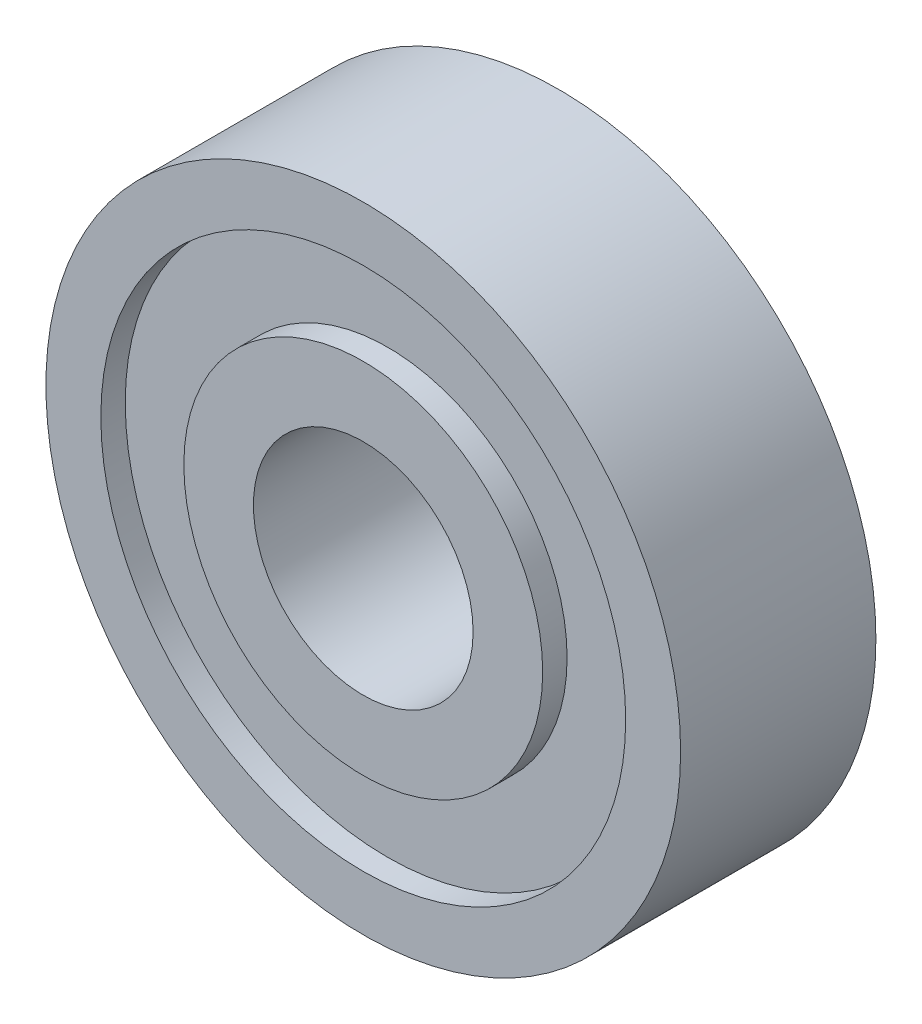
ISO-10303-21;
HEADER;
FILE_DESCRIPTION(('STEP AP214'),'2;1');
FILE_NAME('part.step','',(''),(''),'','','');
FILE_SCHEMA(('AUTOMOTIVE_DESIGN { 1 0 10303 214 1 1 1 1 }'));
ENDSEC;
DATA;
#1=APPLICATION_CONTEXT('core data for automotive mechanical design processes');
#2=APPLICATION_PROTOCOL_DEFINITION('international standard','automotive_design',2000,#1);
#3=PRODUCT_CONTEXT('',#1,'mechanical');
#4=PRODUCT('Part','Part','',(#3));
#5=PRODUCT_RELATED_PRODUCT_CATEGORY('part','',(#4));
#6=PRODUCT_DEFINITION_FORMATION('','',#4);
#7=PRODUCT_DEFINITION_CONTEXT('part definition',#1,'design');
#8=PRODUCT_DEFINITION('design','',#6,#7);
#9=PRODUCT_DEFINITION_SHAPE('','',#8);
#10=(LENGTH_UNIT() NAMED_UNIT(*) SI_UNIT(.MILLI.,.METRE.));
#11=(NAMED_UNIT(*) PLANE_ANGLE_UNIT() SI_UNIT($,.RADIAN.));
#12=(NAMED_UNIT(*) SI_UNIT($,.STERADIAN.) SOLID_ANGLE_UNIT());
#13=UNCERTAINTY_MEASURE_WITH_UNIT(LENGTH_MEASURE(1.E-05),#10,'distance_accuracy_value','');
#14=(GEOMETRIC_REPRESENTATION_CONTEXT(3) GLOBAL_UNCERTAINTY_ASSIGNED_CONTEXT((#13)) GLOBAL_UNIT_ASSIGNED_CONTEXT((#10,
#11,#12)) REPRESENTATION_CONTEXT('',''));
#15=CARTESIAN_POINT('',(0.,0.,0.));
#16=DIRECTION('',(0.,0.,1.));
#17=DIRECTION('',(1.,0.,0.));
#18=AXIS2_PLACEMENT_3D('',#15,#16,#17);
#19=CARTESIAN_POINT('',(0.,0.,0.));
#20=DIRECTION('',(0.,0.,1.));
#21=DIRECTION('',(1.,0.,0.));
#22=AXIS2_PLACEMENT_3D('',#19,#20,#21);
#23=PLANE('',#22);
#24=CARTESIAN_POINT('',(0.,0.,0.));
#25=DIRECTION('',(0.,0.,1.));
#26=DIRECTION('',(1.,0.,0.));
#27=AXIS2_PLACEMENT_3D('',#24,#25,#26);
#28=CIRCLE('',#27,4.5);
#29=CARTESIAN_POINT('',(4.5,0.,0.));
#30=VERTEX_POINT('',#29);
#31=EDGE_CURVE('E45',#30,#30,#28,.T.);
#32=ORIENTED_EDGE('',*,*,#31,.T.);
#33=EDGE_LOOP('',(#32));
#34=FACE_BOUND('',#33,.T.);
#35=CARTESIAN_POINT('',(0.,0.,0.));
#36=DIRECTION('',(0.,0.,-1.));
#37=DIRECTION('',(-1.,0.,0.));
#38=AXIS2_PLACEMENT_3D('',#35,#36,#37);
#39=CIRCLE('',#38,7.35);
#40=CARTESIAN_POINT('',(-7.35,0.,0.));
#41=VERTEX_POINT('',#40);
#42=EDGE_CURVE('E69',#41,#41,#39,.T.);
#43=ORIENTED_EDGE('',*,*,#42,.T.);
#44=EDGE_LOOP('',(#43));
#45=FACE_BOUND('',#44,.T.);
#46=ADVANCED_FACE('F32',(#34,#45),#23,.F.);
#47=CARTESIAN_POINT('',(0.,0.,8.));
#48=DIRECTION('',(0.,0.,1.));
#49=DIRECTION('',(1.,0.,0.));
#50=AXIS2_PLACEMENT_3D('',#47,#48,#49);
#51=PLANE('',#50);
#52=CARTESIAN_POINT('',(0.,0.,8.));
#53=DIRECTION('',(0.,0.,1.));
#54=DIRECTION('',(1.,0.,0.));
#55=AXIS2_PLACEMENT_3D('',#52,#53,#54);
#56=CIRCLE('',#55,4.5);
#57=CARTESIAN_POINT('',(4.5,0.,8.));
#58=VERTEX_POINT('',#57);
#59=EDGE_CURVE('E43',#58,#58,#56,.T.);
#60=ORIENTED_EDGE('',*,*,#59,.F.);
#61=EDGE_LOOP('',(#60));
#62=FACE_BOUND('',#61,.T.);
#63=CARTESIAN_POINT('',(0.,0.,8.));
#64=DIRECTION('',(0.,0.,1.));
#65=DIRECTION('',(1.,0.,0.));
#66=AXIS2_PLACEMENT_3D('',#63,#64,#65);
#67=CIRCLE('',#66,7.35);
#68=CARTESIAN_POINT('',(7.35,0.,8.));
#69=VERTEX_POINT('',#68);
#70=EDGE_CURVE('E57',#69,#69,#67,.T.);
#71=ORIENTED_EDGE('',*,*,#70,.T.);
#72=EDGE_LOOP('',(#71));
#73=FACE_BOUND('',#72,.T.);
#74=ADVANCED_FACE('F107',(#62,#73),#51,.T.);
#75=CARTESIAN_POINT('',(0.,0.,8.));
#76=DIRECTION('',(0.,0.,1.));
#77=DIRECTION('',(1.,0.,0.));
#78=AXIS2_PLACEMENT_3D('',#75,#76,#77);
#79=CIRCLE('',#78,10.75);
#80=CARTESIAN_POINT('',(10.75,0.,8.));
#81=VERTEX_POINT('',#80);
#82=EDGE_CURVE('E51',#81,#81,#79,.T.);
#83=ORIENTED_EDGE('',*,*,#82,.F.);
#84=EDGE_LOOP('',(#83));
#85=FACE_BOUND('',#84,.T.);
#86=CARTESIAN_POINT('',(0.,0.,8.));
#87=DIRECTION('',(0.,0.,1.));
#88=DIRECTION('',(1.,0.,0.));
#89=AXIS2_PLACEMENT_3D('',#86,#87,#88);
#90=CIRCLE('',#89,13.);
#91=CARTESIAN_POINT('',(13.,0.,8.));
#92=VERTEX_POINT('',#91);
#93=EDGE_CURVE('E10',#92,#92,#90,.T.);
#94=ORIENTED_EDGE('',*,*,#93,.T.);
#95=EDGE_LOOP('',(#94));
#96=FACE_BOUND('',#95,.T.);
#97=ADVANCED_FACE('F94',(#85,#96),#51,.T.);
#98=CARTESIAN_POINT('',(0.,0.,0.));
#99=DIRECTION('',(0.,0.,-1.));
#100=DIRECTION('',(-1.,0.,0.));
#101=AXIS2_PLACEMENT_3D('',#98,#99,#100);
#102=CIRCLE('',#101,10.75);
#103=CARTESIAN_POINT('',(-10.75,0.,0.));
#104=VERTEX_POINT('',#103);
#105=EDGE_CURVE('E63',#104,#104,#102,.T.);
#106=ORIENTED_EDGE('',*,*,#105,.F.);
#107=EDGE_LOOP('',(#106));
#108=FACE_BOUND('',#107,.T.);
#109=CARTESIAN_POINT('',(0.,0.,0.));
#110=DIRECTION('',(0.,0.,1.));
#111=DIRECTION('',(1.,0.,0.));
#112=AXIS2_PLACEMENT_3D('',#109,#110,#111);
#113=CIRCLE('',#112,13.);
#114=CARTESIAN_POINT('',(13.,0.,0.));
#115=VERTEX_POINT('',#114);
#116=EDGE_CURVE('E36',#115,#115,#113,.T.);
#117=ORIENTED_EDGE('',*,*,#116,.F.);
#118=EDGE_LOOP('',(#117));
#119=FACE_BOUND('',#118,.T.);
#120=ADVANCED_FACE('F91',(#108,#119),#23,.F.);
#121=CARTESIAN_POINT('',(0.,0.,8.));
#122=DIRECTION('',(0.,0.,-1.));
#123=DIRECTION('',(-1.,0.,0.));
#124=AXIS2_PLACEMENT_3D('',#121,#122,#123);
#125=CYLINDRICAL_SURFACE('',#124,13.);
#126=ORIENTED_EDGE('',*,*,#93,.F.);
#127=EDGE_LOOP('',(#126));
#128=FACE_BOUND('',#127,.T.);
#129=ORIENTED_EDGE('',*,*,#116,.T.);
#130=EDGE_LOOP('',(#129));
#131=FACE_BOUND('',#130,.T.);
#132=ADVANCED_FACE('F34',(#128,#131),#125,.T.);
#133=CARTESIAN_POINT('',(0.,0.,8.));
#134=DIRECTION('',(0.,0.,-1.));
#135=DIRECTION('',(-1.,0.,0.));
#136=AXIS2_PLACEMENT_3D('',#133,#134,#135);
#137=CYLINDRICAL_SURFACE('',#136,4.5);
#138=ORIENTED_EDGE('',*,*,#59,.T.);
#139=EDGE_LOOP('',(#138));
#140=FACE_BOUND('',#139,.T.);
#141=ORIENTED_EDGE('',*,*,#31,.F.);
#142=EDGE_LOOP('',(#141));
#143=FACE_BOUND('',#142,.T.);
#144=ADVANCED_FACE('F98',(#140,#143),#137,.F.);
#145=CARTESIAN_POINT('',(0.,0.,7.));
#146=DIRECTION('',(0.,0.,1.));
#147=DIRECTION('',(1.,0.,0.));
#148=AXIS2_PLACEMENT_3D('',#145,#146,#147);
#149=CYLINDRICAL_SURFACE('',#148,10.75);
#150=CARTESIAN_POINT('',(0.,0.,7.));
#151=DIRECTION('',(0.,0.,1.));
#152=DIRECTION('',(1.,0.,0.));
#153=AXIS2_PLACEMENT_3D('',#150,#151,#152);
#154=CIRCLE('',#153,10.75);
#155=CARTESIAN_POINT('',(10.75,0.,7.));
#156=VERTEX_POINT('',#155);
#157=EDGE_CURVE('E48',#156,#156,#154,.T.);
#158=ORIENTED_EDGE('',*,*,#157,.F.);
#159=EDGE_LOOP('',(#158));
#160=FACE_BOUND('',#159,.T.);
#161=ORIENTED_EDGE('',*,*,#82,.T.);
#162=EDGE_LOOP('',(#161));
#163=FACE_BOUND('',#162,.T.);
#164=ADVANCED_FACE('F103',(#160,#163),#149,.F.);
#165=CARTESIAN_POINT('',(0.,0.,7.));
#166=DIRECTION('',(0.,0.,1.));
#167=DIRECTION('',(1.,0.,0.));
#168=AXIS2_PLACEMENT_3D('',#165,#166,#167);
#169=PLANE('',#168);
#170=CARTESIAN_POINT('',(0.,0.,7.));
#171=DIRECTION('',(0.,0.,1.));
#172=DIRECTION('',(1.,0.,0.));
#173=AXIS2_PLACEMENT_3D('',#170,#171,#172);
#174=CIRCLE('',#173,7.35);
#175=CARTESIAN_POINT('',(7.35,0.,7.));
#176=VERTEX_POINT('',#175);
#177=EDGE_CURVE('E54',#176,#176,#174,.T.);
#178=ORIENTED_EDGE('',*,*,#177,.F.);
#179=EDGE_LOOP('',(#178));
#180=FACE_BOUND('',#179,.T.);
#181=ORIENTED_EDGE('',*,*,#157,.T.);
#182=EDGE_LOOP('',(#181));
#183=FACE_BOUND('',#182,.T.);
#184=ADVANCED_FACE('F120',(#180,#183),#169,.T.);
#185=CARTESIAN_POINT('',(0.,0.,7.));
#186=DIRECTION('',(0.,0.,1.));
#187=DIRECTION('',(1.,0.,0.));
#188=AXIS2_PLACEMENT_3D('',#185,#186,#187);
#189=CYLINDRICAL_SURFACE('',#188,7.35);
#190=ORIENTED_EDGE('',*,*,#177,.T.);
#191=EDGE_LOOP('',(#190));
#192=FACE_BOUND('',#191,.T.);
#193=ORIENTED_EDGE('',*,*,#70,.F.);
#194=EDGE_LOOP('',(#193));
#195=FACE_BOUND('',#194,.T.);
#196=ADVANCED_FACE('F87',(#192,#195),#189,.T.);
#197=CARTESIAN_POINT('',(0.,0.,1.));
#198=DIRECTION('',(0.,0.,-1.));
#199=DIRECTION('',(-1.,0.,0.));
#200=AXIS2_PLACEMENT_3D('',#197,#198,#199);
#201=CYLINDRICAL_SURFACE('',#200,10.75);
#202=CARTESIAN_POINT('',(0.,0.,1.));
#203=DIRECTION('',(0.,0.,-1.));
#204=DIRECTION('',(-1.,0.,0.));
#205=AXIS2_PLACEMENT_3D('',#202,#203,#204);
#206=CIRCLE('',#205,10.75);
#207=CARTESIAN_POINT('',(-10.75,0.,1.));
#208=VERTEX_POINT('',#207);
#209=EDGE_CURVE('E60',#208,#208,#206,.T.);
#210=ORIENTED_EDGE('',*,*,#209,.F.);
#211=EDGE_LOOP('',(#210));
#212=FACE_BOUND('',#211,.T.);
#213=ORIENTED_EDGE('',*,*,#105,.T.);
#214=EDGE_LOOP('',(#213));
#215=FACE_BOUND('',#214,.T.);
#216=ADVANCED_FACE('F81',(#212,#215),#201,.F.);
#217=CARTESIAN_POINT('',(0.,0.,1.));
#218=DIRECTION('',(0.,0.,-1.));
#219=DIRECTION('',(-1.,0.,0.));
#220=AXIS2_PLACEMENT_3D('',#217,#218,#219);
#221=PLANE('',#220);
#222=CARTESIAN_POINT('',(0.,0.,1.));
#223=DIRECTION('',(0.,0.,-1.));
#224=DIRECTION('',(-1.,0.,0.));
#225=AXIS2_PLACEMENT_3D('',#222,#223,#224);
#226=CIRCLE('',#225,7.35);
#227=CARTESIAN_POINT('',(-7.35,0.,1.));
#228=VERTEX_POINT('',#227);
#229=EDGE_CURVE('E66',#228,#228,#226,.T.);
#230=ORIENTED_EDGE('',*,*,#229,.F.);
#231=EDGE_LOOP('',(#230));
#232=FACE_BOUND('',#231,.T.);
#233=ORIENTED_EDGE('',*,*,#209,.T.);
#234=EDGE_LOOP('',(#233));
#235=FACE_BOUND('',#234,.T.);
#236=ADVANCED_FACE('F78',(#232,#235),#221,.T.);
#237=CARTESIAN_POINT('',(0.,0.,1.));
#238=DIRECTION('',(0.,0.,-1.));
#239=DIRECTION('',(-1.,0.,0.));
#240=AXIS2_PLACEMENT_3D('',#237,#238,#239);
#241=CYLINDRICAL_SURFACE('',#240,7.35);
#242=ORIENTED_EDGE('',*,*,#229,.T.);
#243=EDGE_LOOP('',(#242));
#244=FACE_BOUND('',#243,.T.);
#245=ORIENTED_EDGE('',*,*,#42,.F.);
#246=EDGE_LOOP('',(#245));
#247=FACE_BOUND('',#246,.T.);
#248=ADVANCED_FACE('F75',(#244,#247),#241,.T.);
#249=CLOSED_SHELL('',(#46,#74,#97,#120,#132,#144,#164,#184,#196,#216,#236,#248));
#250=MANIFOLD_SOLID_BREP('B2',#249);
#251=ADVANCED_BREP_SHAPE_REPRESENTATION('',(#18,#250),#14);
#252=SHAPE_DEFINITION_REPRESENTATION(#9,#251);
ENDSEC;
END-ISO-10303-21;
